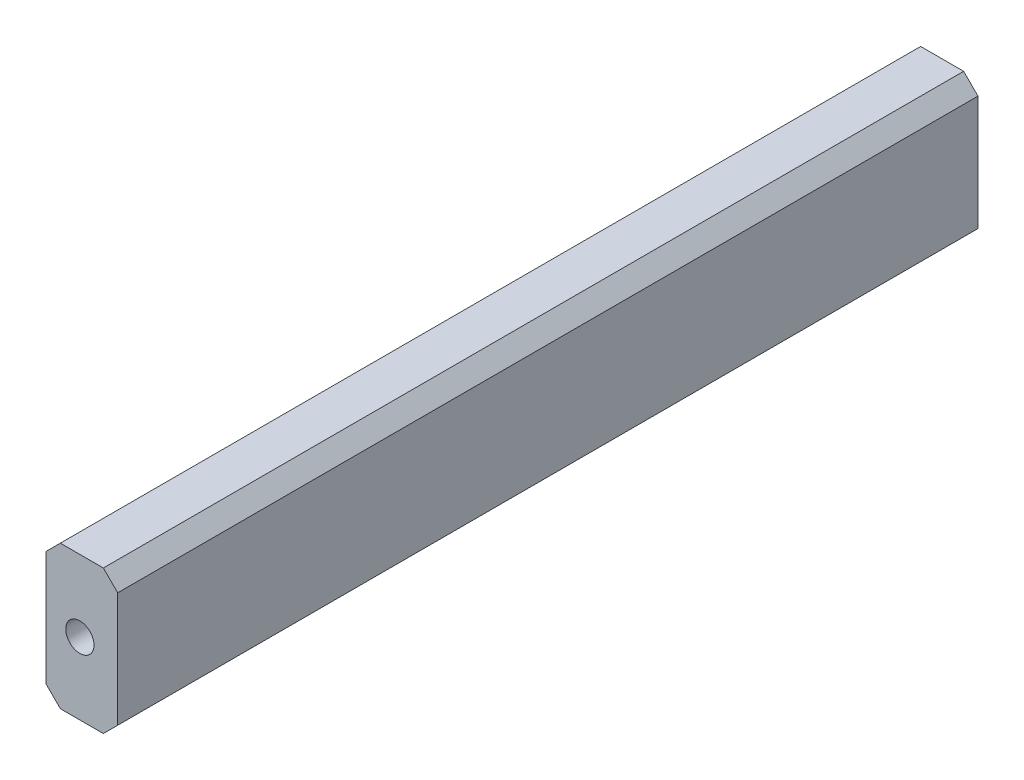
ISO-10303-21;
HEADER;
FILE_DESCRIPTION(('STEP AP214'),'2;1');
FILE_NAME('part.step','',(''),(''),'','','');
FILE_SCHEMA(('AUTOMOTIVE_DESIGN { 1 0 10303 214 1 1 1 1 }'));
ENDSEC;
DATA;
#1=APPLICATION_CONTEXT('core data for automotive mechanical design processes');
#2=APPLICATION_PROTOCOL_DEFINITION('international standard','automotive_design',2000,#1);
#3=PRODUCT_CONTEXT('',#1,'mechanical');
#4=PRODUCT('Part','Part','',(#3));
#5=PRODUCT_RELATED_PRODUCT_CATEGORY('part','',(#4));
#6=PRODUCT_DEFINITION_FORMATION('','',#4);
#7=PRODUCT_DEFINITION_CONTEXT('part definition',#1,'design');
#8=PRODUCT_DEFINITION('design','',#6,#7);
#9=PRODUCT_DEFINITION_SHAPE('','',#8);
#10=(LENGTH_UNIT() NAMED_UNIT(*) SI_UNIT(.MILLI.,.METRE.));
#11=(NAMED_UNIT(*) PLANE_ANGLE_UNIT() SI_UNIT($,.RADIAN.));
#12=(NAMED_UNIT(*) SI_UNIT($,.STERADIAN.) SOLID_ANGLE_UNIT());
#13=UNCERTAINTY_MEASURE_WITH_UNIT(LENGTH_MEASURE(1.E-05),#10,'distance_accuracy_value','');
#14=(GEOMETRIC_REPRESENTATION_CONTEXT(3) GLOBAL_UNCERTAINTY_ASSIGNED_CONTEXT((#13)) GLOBAL_UNIT_ASSIGNED_CONTEXT((#10,
#11,#12)) REPRESENTATION_CONTEXT('',''));
#15=CARTESIAN_POINT('',(0.,0.,0.));
#16=DIRECTION('',(0.,0.,1.));
#17=DIRECTION('',(1.,0.,0.));
#18=AXIS2_PLACEMENT_3D('',#15,#16,#17);
#19=CARTESIAN_POINT('',(-39.325,39.5188,76.2));
#20=DIRECTION('',(0.,0.,1.));
#21=DIRECTION('',(1.,0.,0.));
#22=AXIS2_PLACEMENT_3D('',#19,#20,#21);
#23=PLANE('',#22);
#24=CARTESIAN_POINT('',(-39.5,39.524,76.2));
#25=DIRECTION('',(0.,0.,-1.));
#26=DIRECTION('',(1.,0.,0.));
#27=AXIS2_PLACEMENT_3D('',#24,#25,#26);
#28=CIRCLE('',#27,1.25);
#29=CARTESIAN_POINT('',(-40.75,39.524,76.2));
#30=VERTEX_POINT('',#29);
#31=EDGE_CURVE('E177',#30,#30,#28,.T.);
#32=ORIENTED_EDGE('',*,*,#31,.T.);
#33=EDGE_LOOP('',(#32));
#34=FACE_BOUND('',#33,.T.);
#35=DIRECTION('',(-0.707106781186561,0.707106781186534,0.));
#36=VECTOR('',#35,1.);
#37=CARTESIAN_POINT('',(-42.65875,34.59755,76.2));
#38=LINE('',#37,#36);
#39=CARTESIAN_POINT('',(-41.23,33.1688,76.2));
#40=VERTEX_POINT('',#39);
#41=CARTESIAN_POINT('',(-42.5,34.4388,76.2));
#42=VERTEX_POINT('',#41);
#43=EDGE_CURVE('E173',#40,#42,#38,.T.);
#44=ORIENTED_EDGE('',*,*,#43,.F.);
#45=DIRECTION('',(1.,0.,0.));
#46=VECTOR('',#45,1.);
#47=CARTESIAN_POINT('',(-42.5,33.1688,76.2));
#48=LINE('',#47,#46);
#49=CARTESIAN_POINT('',(-37.42,33.1688,76.2));
#50=VERTEX_POINT('',#49);
#51=EDGE_CURVE('E107',#40,#50,#48,.T.);
#52=ORIENTED_EDGE('',*,*,#51,.T.);
#53=DIRECTION('',(-0.707106781186546,-0.707106781186549,0.));
#54=VECTOR('',#53,1.);
#55=CARTESIAN_POINT('',(-35.99125,34.59755,76.2));
#56=LINE('',#55,#54);
#57=CARTESIAN_POINT('',(-36.15,34.4388,76.2));
#58=VERTEX_POINT('',#57);
#59=EDGE_CURVE('E144',#58,#50,#56,.T.);
#60=ORIENTED_EDGE('',*,*,#59,.F.);
#61=DIRECTION('',(0.,1.,0.));
#62=VECTOR('',#61,1.);
#63=CARTESIAN_POINT('',(-36.15,33.1688,76.2));
#64=LINE('',#63,#62);
#65=CARTESIAN_POINT('',(-36.15,44.5988,76.2));
#66=VERTEX_POINT('',#65);
#67=EDGE_CURVE('E143',#58,#66,#64,.T.);
#68=ORIENTED_EDGE('',*,*,#67,.T.);
#69=DIRECTION('',(0.707106781186548,-0.707106781186548,0.));
#70=VECTOR('',#69,1.);
#71=CARTESIAN_POINT('',(-35.99125,44.44005,76.2));
#72=LINE('',#71,#70);
#73=CARTESIAN_POINT('',(-37.42,45.8688,76.2));
#74=VERTEX_POINT('',#73);
#75=EDGE_CURVE('E133',#74,#66,#72,.T.);
#76=ORIENTED_EDGE('',*,*,#75,.F.);
#77=DIRECTION('',(-1.,0.,0.));
#78=VECTOR('',#77,1.);
#79=CARTESIAN_POINT('',(-36.15,45.8688,76.2));
#80=LINE('',#79,#78);
#81=CARTESIAN_POINT('',(-41.23,45.8688,76.2));
#82=VERTEX_POINT('',#81);
#83=EDGE_CURVE('E11',#74,#82,#80,.T.);
#84=ORIENTED_EDGE('',*,*,#83,.T.);
#85=DIRECTION('',(0.707106781186538,0.707106781186558,0.));
#86=VECTOR('',#85,1.);
#87=CARTESIAN_POINT('',(-42.65875,44.44005,76.2));
#88=LINE('',#87,#86);
#89=CARTESIAN_POINT('',(-42.5,44.5988,76.2));
#90=VERTEX_POINT('',#89);
#91=EDGE_CURVE('E149',#90,#82,#88,.T.);
#92=ORIENTED_EDGE('',*,*,#91,.F.);
#93=DIRECTION('',(0.,-1.,0.));
#94=VECTOR('',#93,1.);
#95=CARTESIAN_POINT('',(-42.5,45.8688,76.2));
#96=LINE('',#95,#94);
#97=EDGE_CURVE('E117',#90,#42,#96,.T.);
#98=ORIENTED_EDGE('',*,*,#97,.T.);
#99=EDGE_LOOP('',(#44,#52,#60,#68,#76,#84,#92,#98));
#100=FACE_BOUND('',#99,.T.);
#101=ADVANCED_FACE('F17',(#34,#100),#23,.T.);
#102=CARTESIAN_POINT('',(-36.15,45.8688,0.));
#103=DIRECTION('',(0.,1.,0.));
#104=DIRECTION('',(1.,0.,0.));
#105=AXIS2_PLACEMENT_3D('',#102,#103,#104);
#106=PLANE('',#105);
#107=DIRECTION('',(0.,0.,-1.));
#108=VECTOR('',#107,1.);
#109=CARTESIAN_POINT('',(-41.23,45.8688,0.));
#110=LINE('',#109,#108);
#111=CARTESIAN_POINT('',(-41.23,45.8688,0.));
#112=VERTEX_POINT('',#111);
#113=EDGE_CURVE('E195',#82,#112,#110,.T.);
#114=ORIENTED_EDGE('',*,*,#113,.F.);
#115=ORIENTED_EDGE('',*,*,#83,.F.);
#116=DIRECTION('',(0.,0.,1.));
#117=VECTOR('',#116,1.);
#118=CARTESIAN_POINT('',(-37.42,45.8688,0.));
#119=LINE('',#118,#117);
#120=CARTESIAN_POINT('',(-37.42,45.8688,0.));
#121=VERTEX_POINT('',#120);
#122=EDGE_CURVE('E28',#121,#74,#119,.T.);
#123=ORIENTED_EDGE('',*,*,#122,.F.);
#124=DIRECTION('',(-1.,0.,0.));
#125=VECTOR('',#124,1.);
#126=CARTESIAN_POINT('',(-36.15,45.8688,0.));
#127=LINE('',#126,#125);
#128=EDGE_CURVE('E187',#121,#112,#127,.T.);
#129=ORIENTED_EDGE('',*,*,#128,.T.);
#130=EDGE_LOOP('',(#114,#115,#123,#129));
#131=FACE_BOUND('',#130,.T.);
#132=ADVANCED_FACE('F348',(#131),#106,.T.);
#133=CARTESIAN_POINT('',(-36.785,45.2338,0.));
#134=DIRECTION('',(0.707106781186548,0.707106781186548,0.));
#135=DIRECTION('',(0.,0.,-1.));
#136=AXIS2_PLACEMENT_3D('',#133,#134,#135);
#137=PLANE('',#136);
#138=ORIENTED_EDGE('',*,*,#75,.T.);
#139=DIRECTION('',(0.,0.,-1.));
#140=VECTOR('',#139,1.);
#141=CARTESIAN_POINT('',(-36.15,44.5988,0.));
#142=LINE('',#141,#140);
#143=CARTESIAN_POINT('',(-36.15,44.5988,0.));
#144=VERTEX_POINT('',#143);
#145=EDGE_CURVE('E138',#66,#144,#142,.T.);
#146=ORIENTED_EDGE('',*,*,#145,.T.);
#147=DIRECTION('',(-0.707106781186548,0.707106781186548,0.));
#148=VECTOR('',#147,1.);
#149=CARTESIAN_POINT('',(-35.99125,44.44005,0.));
#150=LINE('',#149,#148);
#151=EDGE_CURVE('E166',#144,#121,#150,.T.);
#152=ORIENTED_EDGE('',*,*,#151,.T.);
#153=ORIENTED_EDGE('',*,*,#122,.T.);
#154=EDGE_LOOP('',(#138,#146,#152,#153));
#155=FACE_BOUND('',#154,.T.);
#156=ADVANCED_FACE('F135',(#155),#137,.T.);
#157=CARTESIAN_POINT('',(-42.5,45.8688,0.));
#158=DIRECTION('',(-1.,0.,0.));
#159=DIRECTION('',(0.,1.,0.));
#160=AXIS2_PLACEMENT_3D('',#157,#158,#159);
#161=PLANE('',#160);
#162=DIRECTION('',(0.,0.,-1.));
#163=VECTOR('',#162,1.);
#164=CARTESIAN_POINT('',(-42.5,34.4388,0.));
#165=LINE('',#164,#163);
#166=CARTESIAN_POINT('',(-42.5,34.4388,0.));
#167=VERTEX_POINT('',#166);
#168=EDGE_CURVE('E199',#42,#167,#165,.T.);
#169=ORIENTED_EDGE('',*,*,#168,.F.);
#170=ORIENTED_EDGE('',*,*,#97,.F.);
#171=DIRECTION('',(0.,0.,1.));
#172=VECTOR('',#171,1.);
#173=CARTESIAN_POINT('',(-42.5,44.5988,0.));
#174=LINE('',#173,#172);
#175=CARTESIAN_POINT('',(-42.5,44.5988,0.));
#176=VERTEX_POINT('',#175);
#177=EDGE_CURVE('E21',#176,#90,#174,.T.);
#178=ORIENTED_EDGE('',*,*,#177,.F.);
#179=DIRECTION('',(0.,-1.,0.));
#180=VECTOR('',#179,1.);
#181=CARTESIAN_POINT('',(-42.5,45.8688,0.));
#182=LINE('',#181,#180);
#183=EDGE_CURVE('E178',#176,#167,#182,.T.);
#184=ORIENTED_EDGE('',*,*,#183,.T.);
#185=EDGE_LOOP('',(#169,#170,#178,#184));
#186=FACE_BOUND('',#185,.T.);
#187=ADVANCED_FACE('F250',(#186),#161,.T.);
#188=CARTESIAN_POINT('',(-41.865,45.2338,0.));
#189=DIRECTION('',(-0.707106781186557,0.707106781186538,0.));
#190=DIRECTION('',(0.,0.,1.));
#191=AXIS2_PLACEMENT_3D('',#188,#189,#190);
#192=PLANE('',#191);
#193=ORIENTED_EDGE('',*,*,#91,.T.);
#194=ORIENTED_EDGE('',*,*,#113,.T.);
#195=DIRECTION('',(-0.707106781186538,-0.707106781186558,0.));
#196=VECTOR('',#195,1.);
#197=CARTESIAN_POINT('',(-42.65875,44.44005,0.));
#198=LINE('',#197,#196);
#199=EDGE_CURVE('E181',#112,#176,#198,.T.);
#200=ORIENTED_EDGE('',*,*,#199,.T.);
#201=ORIENTED_EDGE('',*,*,#177,.T.);
#202=EDGE_LOOP('',(#193,#194,#200,#201));
#203=FACE_BOUND('',#202,.T.);
#204=ADVANCED_FACE('F244',(#203),#192,.T.);
#205=CARTESIAN_POINT('',(-36.15,33.1688,0.));
#206=DIRECTION('',(1.,0.,0.));
#207=DIRECTION('',(0.,1.,0.));
#208=AXIS2_PLACEMENT_3D('',#205,#206,#207);
#209=PLANE('',#208);
#210=DIRECTION('',(0.,0.,1.));
#211=VECTOR('',#210,1.);
#212=CARTESIAN_POINT('',(-36.15,34.4388,0.));
#213=LINE('',#212,#211);
#214=CARTESIAN_POINT('',(-36.15,34.4388,0.));
#215=VERTEX_POINT('',#214);
#216=EDGE_CURVE('E156',#215,#58,#213,.T.);
#217=ORIENTED_EDGE('',*,*,#216,.F.);
#218=DIRECTION('',(0.,1.,0.));
#219=VECTOR('',#218,1.);
#220=CARTESIAN_POINT('',(-36.15,33.1688,0.));
#221=LINE('',#220,#219);
#222=EDGE_CURVE('E153',#215,#144,#221,.T.);
#223=ORIENTED_EDGE('',*,*,#222,.T.);
#224=ORIENTED_EDGE('',*,*,#145,.F.);
#225=ORIENTED_EDGE('',*,*,#67,.F.);
#226=EDGE_LOOP('',(#217,#223,#224,#225));
#227=FACE_BOUND('',#226,.T.);
#228=ADVANCED_FACE('F151',(#227),#209,.T.);
#229=CARTESIAN_POINT('',(-36.785,33.8038,0.));
#230=DIRECTION('',(0.707106781186549,-0.707106781186546,0.));
#231=DIRECTION('',(0.,0.,-1.));
#232=AXIS2_PLACEMENT_3D('',#229,#230,#231);
#233=PLANE('',#232);
#234=ORIENTED_EDGE('',*,*,#59,.T.);
#235=DIRECTION('',(0.,0.,-1.));
#236=VECTOR('',#235,1.);
#237=CARTESIAN_POINT('',(-37.42,33.1688,0.));
#238=LINE('',#237,#236);
#239=CARTESIAN_POINT('',(-37.42,33.1688,0.));
#240=VERTEX_POINT('',#239);
#241=EDGE_CURVE('E184',#50,#240,#238,.T.);
#242=ORIENTED_EDGE('',*,*,#241,.T.);
#243=DIRECTION('',(0.707106781186546,0.707106781186549,0.));
#244=VECTOR('',#243,1.);
#245=CARTESIAN_POINT('',(-35.99125,34.59755,0.));
#246=LINE('',#245,#244);
#247=EDGE_CURVE('E165',#240,#215,#246,.T.);
#248=ORIENTED_EDGE('',*,*,#247,.T.);
#249=ORIENTED_EDGE('',*,*,#216,.T.);
#250=EDGE_LOOP('',(#234,#242,#248,#249));
#251=FACE_BOUND('',#250,.T.);
#252=ADVANCED_FACE('F359',(#251),#233,.T.);
#253=CARTESIAN_POINT('',(-39.325,39.5188,0.));
#254=DIRECTION('',(0.,0.,1.));
#255=DIRECTION('',(0.,-1.,0.));
#256=AXIS2_PLACEMENT_3D('',#253,#254,#255);
#257=PLANE('',#256);
#258=CARTESIAN_POINT('',(-39.5,39.524,0.));
#259=DIRECTION('',(0.,0.,1.));
#260=DIRECTION('',(-1.,0.,0.));
#261=AXIS2_PLACEMENT_3D('',#258,#259,#260);
#262=CIRCLE('',#261,1.25);
#263=CARTESIAN_POINT('',(-38.25,39.524,0.));
#264=VERTEX_POINT('',#263);
#265=EDGE_CURVE('E167',#264,#264,#262,.T.);
#266=ORIENTED_EDGE('',*,*,#265,.T.);
#267=EDGE_LOOP('',(#266));
#268=FACE_BOUND('',#267,.T.);
#269=DIRECTION('',(0.707106781186561,-0.707106781186534,0.));
#270=VECTOR('',#269,1.);
#271=CARTESIAN_POINT('',(-42.65875,34.59755,0.));
#272=LINE('',#271,#270);
#273=CARTESIAN_POINT('',(-41.23,33.1688,0.));
#274=VERTEX_POINT('',#273);
#275=EDGE_CURVE('E204',#167,#274,#272,.T.);
#276=ORIENTED_EDGE('',*,*,#275,.F.);
#277=ORIENTED_EDGE('',*,*,#183,.F.);
#278=ORIENTED_EDGE('',*,*,#199,.F.);
#279=ORIENTED_EDGE('',*,*,#128,.F.);
#280=ORIENTED_EDGE('',*,*,#151,.F.);
#281=ORIENTED_EDGE('',*,*,#222,.F.);
#282=ORIENTED_EDGE('',*,*,#247,.F.);
#283=DIRECTION('',(1.,0.,0.));
#284=VECTOR('',#283,1.);
#285=CARTESIAN_POINT('',(-42.5,33.1688,0.));
#286=LINE('',#285,#284);
#287=EDGE_CURVE('E203',#274,#240,#286,.T.);
#288=ORIENTED_EDGE('',*,*,#287,.F.);
#289=EDGE_LOOP('',(#276,#277,#278,#279,#280,#281,#282,#288));
#290=FACE_BOUND('',#289,.T.);
#291=ADVANCED_FACE('F248',(#268,#290),#257,.F.);
#292=CARTESIAN_POINT('',(-42.5,33.1688,0.));
#293=DIRECTION('',(0.,-1.,0.));
#294=DIRECTION('',(0.,0.,-1.));
#295=AXIS2_PLACEMENT_3D('',#292,#293,#294);
#296=PLANE('',#295);
#297=DIRECTION('',(0.,0.,1.));
#298=VECTOR('',#297,1.);
#299=CARTESIAN_POINT('',(-41.23,33.1688,0.));
#300=LINE('',#299,#298);
#301=EDGE_CURVE('E200',#274,#40,#300,.T.);
#302=ORIENTED_EDGE('',*,*,#301,.F.);
#303=ORIENTED_EDGE('',*,*,#287,.T.);
#304=ORIENTED_EDGE('',*,*,#241,.F.);
#305=ORIENTED_EDGE('',*,*,#51,.F.);
#306=EDGE_LOOP('',(#302,#303,#304,#305));
#307=FACE_BOUND('',#306,.T.);
#308=ADVANCED_FACE('F343',(#307),#296,.T.);
#309=CARTESIAN_POINT('',(-41.865,33.8038,0.));
#310=DIRECTION('',(-0.707106781186534,-0.707106781186561,0.));
#311=DIRECTION('',(-0.707106781186561,0.707106781186534,0.));
#312=AXIS2_PLACEMENT_3D('',#309,#310,#311);
#313=PLANE('',#312);
#314=ORIENTED_EDGE('',*,*,#43,.T.);
#315=ORIENTED_EDGE('',*,*,#168,.T.);
#316=ORIENTED_EDGE('',*,*,#275,.T.);
#317=ORIENTED_EDGE('',*,*,#301,.T.);
#318=EDGE_LOOP('',(#314,#315,#316,#317));
#319=FACE_BOUND('',#318,.T.);
#320=ADVANCED_FACE('F338',(#319),#313,.T.);
#321=CARTESIAN_POINT('',(-39.5,39.524,70.2));
#322=DIRECTION('',(0.,0.,1.));
#323=DIRECTION('',(1.,0.,0.));
#324=AXIS2_PLACEMENT_3D('',#321,#322,#323);
#325=PLANE('',#324);
#326=CARTESIAN_POINT('',(-39.5,39.524,70.2));
#327=DIRECTION('',(0.,0.,-1.));
#328=DIRECTION('',(1.,0.,0.));
#329=AXIS2_PLACEMENT_3D('',#326,#327,#328);
#330=CIRCLE('',#329,1.25);
#331=CARTESIAN_POINT('',(-40.75,39.524,70.2));
#332=VERTEX_POINT('',#331);
#333=EDGE_CURVE('E170',#332,#332,#330,.T.);
#334=ORIENTED_EDGE('',*,*,#333,.F.);
#335=EDGE_LOOP('',(#334));
#336=FACE_BOUND('',#335,.T.);
#337=ADVANCED_FACE('F342',(#336),#325,.T.);
#338=CARTESIAN_POINT('',(-39.5,39.524,76.2));
#339=DIRECTION('',(0.,0.,-1.));
#340=DIRECTION('',(1.,0.,0.));
#341=AXIS2_PLACEMENT_3D('',#338,#339,#340);
#342=CYLINDRICAL_SURFACE('',#341,1.25);
#343=ORIENTED_EDGE('',*,*,#31,.F.);
#344=DIRECTION('',(0.,0.,-1.));
#345=VECTOR('',#344,1.);
#346=CARTESIAN_POINT('',(-40.75,39.524,76.2));
#347=LINE('',#346,#345);
#348=EDGE_CURVE('E174',#30,#332,#347,.T.);
#349=ORIENTED_EDGE('',*,*,#348,.T.);
#350=ORIENTED_EDGE('',*,*,#333,.T.);
#351=ORIENTED_EDGE('',*,*,#348,.F.);
#352=EDGE_LOOP('',(#343,#349,#350,#351));
#353=FACE_BOUND('',#352,.T.);
#354=ADVANCED_FACE('F387',(#353),#342,.F.);
#355=CARTESIAN_POINT('',(-39.5,39.524,6.));
#356=DIRECTION('',(0.,0.,-1.));
#357=DIRECTION('',(-1.,0.,0.));
#358=AXIS2_PLACEMENT_3D('',#355,#356,#357);
#359=PLANE('',#358);
#360=CARTESIAN_POINT('',(-39.5,39.524,6.));
#361=DIRECTION('',(0.,0.,1.));
#362=DIRECTION('',(-1.,0.,0.));
#363=AXIS2_PLACEMENT_3D('',#360,#361,#362);
#364=CIRCLE('',#363,1.25);
#365=CARTESIAN_POINT('',(-38.25,39.524,6.));
#366=VERTEX_POINT('',#365);
#367=EDGE_CURVE('E82',#366,#366,#364,.T.);
#368=ORIENTED_EDGE('',*,*,#367,.F.);
#369=EDGE_LOOP('',(#368));
#370=FACE_BOUND('',#369,.T.);
#371=ADVANCED_FACE('F334',(#370),#359,.T.);
#372=CARTESIAN_POINT('',(-39.5,39.524,0.));
#373=DIRECTION('',(0.,0.,1.));
#374=DIRECTION('',(-1.,0.,0.));
#375=AXIS2_PLACEMENT_3D('',#372,#373,#374);
#376=CYLINDRICAL_SURFACE('',#375,1.25);
#377=ORIENTED_EDGE('',*,*,#265,.F.);
#378=DIRECTION('',(0.,0.,1.));
#379=VECTOR('',#378,1.);
#380=CARTESIAN_POINT('',(-38.25,39.524,0.));
#381=LINE('',#380,#379);
#382=EDGE_CURVE('E92',#264,#366,#381,.T.);
#383=ORIENTED_EDGE('',*,*,#382,.T.);
#384=ORIENTED_EDGE('',*,*,#367,.T.);
#385=ORIENTED_EDGE('',*,*,#382,.F.);
#386=EDGE_LOOP('',(#377,#383,#384,#385));
#387=FACE_BOUND('',#386,.T.);
#388=ADVANCED_FACE('F19',(#387),#376,.F.);
#389=CLOSED_SHELL('',(#101,#132,#156,#187,#204,#228,#252,#291,#308,#320,#337,#354,#371,#388));
#390=MANIFOLD_SOLID_BREP('B1',#389);
#391=ADVANCED_BREP_SHAPE_REPRESENTATION('',(#18,#390),#14);
#392=SHAPE_DEFINITION_REPRESENTATION(#9,#391);
ENDSEC;
END-ISO-10303-21;
